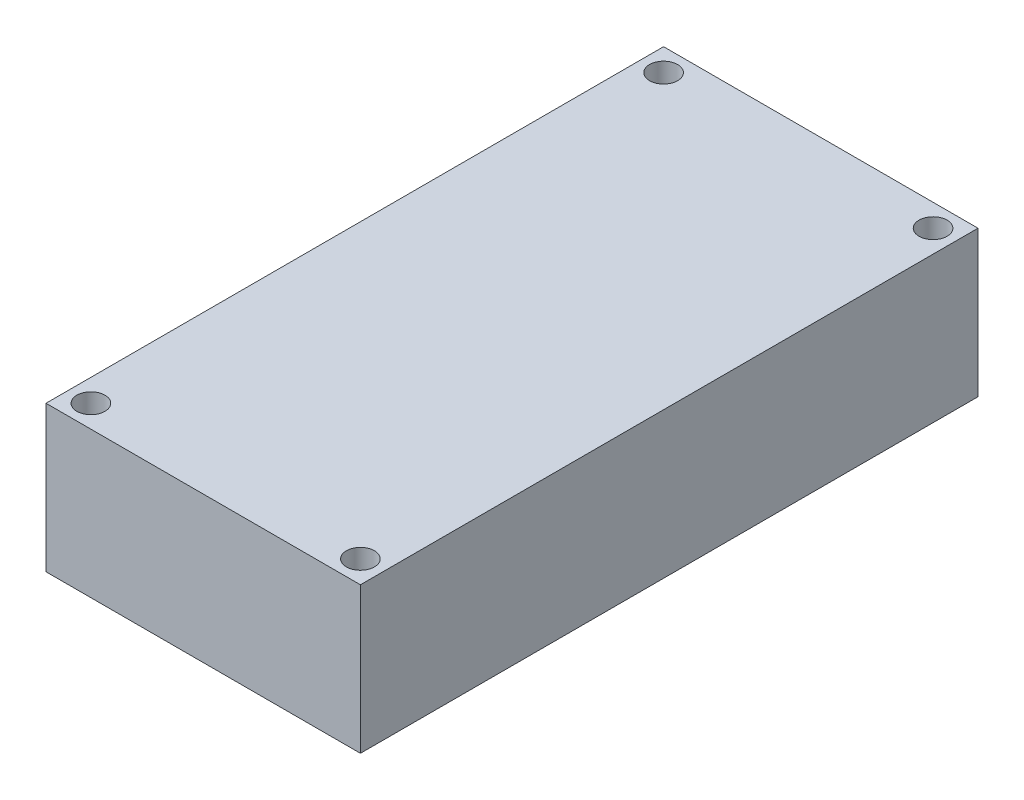
ISO-10303-21;
HEADER;
FILE_DESCRIPTION(('STEP AP214'),'2;1');
FILE_NAME('part.step','',(''),(''),'','','');
FILE_SCHEMA(('AUTOMOTIVE_DESIGN { 1 0 10303 214 1 1 1 1 }'));
ENDSEC;
DATA;
#1=APPLICATION_CONTEXT('core data for automotive mechanical design processes');
#2=APPLICATION_PROTOCOL_DEFINITION('international standard','automotive_design',2000,#1);
#3=PRODUCT_CONTEXT('',#1,'mechanical');
#4=PRODUCT('Part','Part','',(#3));
#5=PRODUCT_RELATED_PRODUCT_CATEGORY('part','',(#4));
#6=PRODUCT_DEFINITION_FORMATION('','',#4);
#7=PRODUCT_DEFINITION_CONTEXT('part definition',#1,'design');
#8=PRODUCT_DEFINITION('design','',#6,#7);
#9=PRODUCT_DEFINITION_SHAPE('','',#8);
#10=(LENGTH_UNIT() NAMED_UNIT(*) SI_UNIT(.MILLI.,.METRE.));
#11=(NAMED_UNIT(*) PLANE_ANGLE_UNIT() SI_UNIT($,.RADIAN.));
#12=(NAMED_UNIT(*) SI_UNIT($,.STERADIAN.) SOLID_ANGLE_UNIT());
#13=UNCERTAINTY_MEASURE_WITH_UNIT(LENGTH_MEASURE(1.E-05),#10,'distance_accuracy_value','');
#14=(GEOMETRIC_REPRESENTATION_CONTEXT(3) GLOBAL_UNCERTAINTY_ASSIGNED_CONTEXT((#13)) GLOBAL_UNIT_ASSIGNED_CONTEXT((#10,
#11,#12)) REPRESENTATION_CONTEXT('',''));
#15=CARTESIAN_POINT('',(0.,0.,0.));
#16=DIRECTION('',(0.,0.,1.));
#17=DIRECTION('',(1.,0.,0.));
#18=AXIS2_PLACEMENT_3D('',#15,#16,#17);
#19=CARTESIAN_POINT('',(-14.,6.49999999999999,27.5));
#20=DIRECTION('',(1.,0.,0.));
#21=DIRECTION('',(0.,1.,0.));
#22=AXIS2_PLACEMENT_3D('',#19,#20,#21);
#23=PLANE('',#22);
#24=DIRECTION('',(0.,-1.,0.));
#25=VECTOR('',#24,1.);
#26=CARTESIAN_POINT('',(-14.,6.49999999999999,-27.5));
#27=LINE('',#26,#25);
#28=CARTESIAN_POINT('',(-14.,6.49999999999999,-27.5));
#29=VERTEX_POINT('',#28);
#30=CARTESIAN_POINT('',(-14.,-6.5,-27.5));
#31=VERTEX_POINT('',#30);
#32=EDGE_CURVE('E97',#29,#31,#27,.T.);
#33=ORIENTED_EDGE('',*,*,#32,.T.);
#34=DIRECTION('',(0.,0.,-1.));
#35=VECTOR('',#34,1.);
#36=CARTESIAN_POINT('',(-14.,-6.5,27.5));
#37=LINE('',#36,#35);
#38=CARTESIAN_POINT('',(-14.,-6.5,27.5));
#39=VERTEX_POINT('',#38);
#40=EDGE_CURVE('E11',#39,#31,#37,.T.);
#41=ORIENTED_EDGE('',*,*,#40,.F.);
#42=DIRECTION('',(0.,-1.,0.));
#43=VECTOR('',#42,1.);
#44=CARTESIAN_POINT('',(-14.,6.49999999999999,27.5));
#45=LINE('',#44,#43);
#46=CARTESIAN_POINT('',(-14.,6.49999999999999,27.5));
#47=VERTEX_POINT('',#46);
#48=EDGE_CURVE('E85',#47,#39,#45,.T.);
#49=ORIENTED_EDGE('',*,*,#48,.F.);
#50=DIRECTION('',(0.,0.,-1.));
#51=VECTOR('',#50,1.);
#52=CARTESIAN_POINT('',(-14.,6.49999999999999,27.5));
#53=LINE('',#52,#51);
#54=EDGE_CURVE('E93',#47,#29,#53,.T.);
#55=ORIENTED_EDGE('',*,*,#54,.T.);
#56=EDGE_LOOP('',(#33,#41,#49,#55));
#57=FACE_BOUND('',#56,.T.);
#58=ADVANCED_FACE('F34',(#57),#23,.F.);
#59=CARTESIAN_POINT('',(14.,-6.49999999999999,27.5));
#60=DIRECTION('',(0.,1.,0.));
#61=DIRECTION('',(-1.,0.,0.));
#62=AXIS2_PLACEMENT_3D('',#59,#60,#61);
#63=PLANE('',#62);
#64=CARTESIAN_POINT('',(-12.,-6.5,25.5));
#65=DIRECTION('',(0.,1.,0.));
#66=DIRECTION('',(1.,0.,0.));
#67=AXIS2_PLACEMENT_3D('',#64,#65,#66);
#68=CIRCLE('',#67,1.25);
#69=CARTESIAN_POINT('',(-10.75,-6.5,25.5));
#70=VERTEX_POINT('',#69);
#71=EDGE_CURVE('E120',#70,#70,#68,.T.);
#72=ORIENTED_EDGE('',*,*,#71,.T.);
#73=EDGE_LOOP('',(#72));
#74=FACE_BOUND('',#73,.T.);
#75=CARTESIAN_POINT('',(12.,-6.5,25.5));
#76=DIRECTION('',(0.,1.,0.));
#77=DIRECTION('',(-1.,0.,0.));
#78=AXIS2_PLACEMENT_3D('',#75,#76,#77);
#79=CIRCLE('',#78,1.25);
#80=CARTESIAN_POINT('',(10.75,-6.5,25.5));
#81=VERTEX_POINT('',#80);
#82=EDGE_CURVE('E126',#81,#81,#79,.T.);
#83=ORIENTED_EDGE('',*,*,#82,.T.);
#84=EDGE_LOOP('',(#83));
#85=FACE_BOUND('',#84,.T.);
#86=CARTESIAN_POINT('',(12.,-6.5,-25.5));
#87=DIRECTION('',(0.,1.,0.));
#88=DIRECTION('',(1.,0.,0.));
#89=AXIS2_PLACEMENT_3D('',#86,#87,#88);
#90=CIRCLE('',#89,1.25);
#91=CARTESIAN_POINT('',(13.25,-6.5,-25.5));
#92=VERTEX_POINT('',#91);
#93=EDGE_CURVE('E114',#92,#92,#90,.T.);
#94=ORIENTED_EDGE('',*,*,#93,.T.);
#95=EDGE_LOOP('',(#94));
#96=FACE_BOUND('',#95,.T.);
#97=CARTESIAN_POINT('',(-12.,-6.5,-25.5));
#98=DIRECTION('',(0.,1.,0.));
#99=DIRECTION('',(-1.,0.,0.));
#100=AXIS2_PLACEMENT_3D('',#97,#98,#99);
#101=CIRCLE('',#100,1.25);
#102=CARTESIAN_POINT('',(-13.25,-6.5,-25.5));
#103=VERTEX_POINT('',#102);
#104=EDGE_CURVE('E100',#103,#103,#101,.T.);
#105=ORIENTED_EDGE('',*,*,#104,.T.);
#106=EDGE_LOOP('',(#105));
#107=FACE_BOUND('',#106,.T.);
#108=DIRECTION('',(1.,0.,0.));
#109=VECTOR('',#108,1.);
#110=CARTESIAN_POINT('',(14.,-6.49999999999999,-27.5));
#111=LINE('',#110,#109);
#112=CARTESIAN_POINT('',(14.,-6.49999999999999,-27.5));
#113=VERTEX_POINT('',#112);
#114=EDGE_CURVE('E89',#31,#113,#111,.T.);
#115=ORIENTED_EDGE('',*,*,#114,.T.);
#116=DIRECTION('',(0.,0.,-1.));
#117=VECTOR('',#116,1.);
#118=CARTESIAN_POINT('',(14.,-6.49999999999999,27.5));
#119=LINE('',#118,#117);
#120=CARTESIAN_POINT('',(14.,-6.49999999999999,27.5));
#121=VERTEX_POINT('',#120);
#122=EDGE_CURVE('E42',#121,#113,#119,.T.);
#123=ORIENTED_EDGE('',*,*,#122,.F.);
#124=DIRECTION('',(1.,0.,0.));
#125=VECTOR('',#124,1.);
#126=CARTESIAN_POINT('',(14.,-6.49999999999999,27.5));
#127=LINE('',#126,#125);
#128=EDGE_CURVE('E80',#39,#121,#127,.T.);
#129=ORIENTED_EDGE('',*,*,#128,.F.);
#130=ORIENTED_EDGE('',*,*,#40,.T.);
#131=EDGE_LOOP('',(#115,#123,#129,#130));
#132=FACE_BOUND('',#131,.T.);
#133=ADVANCED_FACE('F88',(#74,#85,#96,#107,#132),#63,.F.);
#134=CARTESIAN_POINT('',(14.,6.49999999999999,27.5));
#135=DIRECTION('',(-1.,0.,0.));
#136=DIRECTION('',(0.,0.,1.));
#137=AXIS2_PLACEMENT_3D('',#134,#135,#136);
#138=PLANE('',#137);
#139=DIRECTION('',(0.,1.,0.));
#140=VECTOR('',#139,1.);
#141=CARTESIAN_POINT('',(14.,6.49999999999999,-27.5));
#142=LINE('',#141,#140);
#143=CARTESIAN_POINT('',(14.,6.49999999999999,-27.5));
#144=VERTEX_POINT('',#143);
#145=EDGE_CURVE('E67',#113,#144,#142,.T.);
#146=ORIENTED_EDGE('',*,*,#145,.T.);
#147=DIRECTION('',(0.,0.,-1.));
#148=VECTOR('',#147,1.);
#149=CARTESIAN_POINT('',(14.,6.49999999999999,27.5));
#150=LINE('',#149,#148);
#151=CARTESIAN_POINT('',(14.,6.49999999999999,27.5));
#152=VERTEX_POINT('',#151);
#153=EDGE_CURVE('E90',#152,#144,#150,.T.);
#154=ORIENTED_EDGE('',*,*,#153,.F.);
#155=DIRECTION('',(0.,1.,0.));
#156=VECTOR('',#155,1.);
#157=CARTESIAN_POINT('',(14.,6.49999999999999,27.5));
#158=LINE('',#157,#156);
#159=EDGE_CURVE('E83',#121,#152,#158,.T.);
#160=ORIENTED_EDGE('',*,*,#159,.F.);
#161=ORIENTED_EDGE('',*,*,#122,.T.);
#162=EDGE_LOOP('',(#146,#154,#160,#161));
#163=FACE_BOUND('',#162,.T.);
#164=ADVANCED_FACE('F91',(#163),#138,.F.);
#165=CARTESIAN_POINT('',(14.,6.49999999999999,27.5));
#166=DIRECTION('',(0.,-1.,0.));
#167=DIRECTION('',(1.,0.,0.));
#168=AXIS2_PLACEMENT_3D('',#165,#166,#167);
#169=PLANE('',#168);
#170=CARTESIAN_POINT('',(-12.,6.49999999999999,25.5));
#171=DIRECTION('',(0.,1.,0.));
#172=DIRECTION('',(1.,0.,0.));
#173=AXIS2_PLACEMENT_3D('',#170,#171,#172);
#174=CIRCLE('',#173,1.25);
#175=CARTESIAN_POINT('',(-10.75,6.49999999999999,25.5));
#176=VERTEX_POINT('',#175);
#177=EDGE_CURVE('E117',#176,#176,#174,.T.);
#178=ORIENTED_EDGE('',*,*,#177,.F.);
#179=EDGE_LOOP('',(#178));
#180=FACE_BOUND('',#179,.T.);
#181=CARTESIAN_POINT('',(12.,6.49999999999999,25.5));
#182=DIRECTION('',(0.,1.,0.));
#183=DIRECTION('',(-1.,0.,0.));
#184=AXIS2_PLACEMENT_3D('',#181,#182,#183);
#185=CIRCLE('',#184,1.25);
#186=CARTESIAN_POINT('',(10.75,6.49999999999999,25.5));
#187=VERTEX_POINT('',#186);
#188=EDGE_CURVE('E123',#187,#187,#185,.T.);
#189=ORIENTED_EDGE('',*,*,#188,.F.);
#190=EDGE_LOOP('',(#189));
#191=FACE_BOUND('',#190,.T.);
#192=CARTESIAN_POINT('',(12.,6.49999999999999,-25.5));
#193=DIRECTION('',(0.,1.,0.));
#194=DIRECTION('',(1.,0.,0.));
#195=AXIS2_PLACEMENT_3D('',#192,#193,#194);
#196=CIRCLE('',#195,1.25);
#197=CARTESIAN_POINT('',(13.25,6.49999999999999,-25.5));
#198=VERTEX_POINT('',#197);
#199=EDGE_CURVE('E129',#198,#198,#196,.T.);
#200=ORIENTED_EDGE('',*,*,#199,.F.);
#201=EDGE_LOOP('',(#200));
#202=FACE_BOUND('',#201,.T.);
#203=CARTESIAN_POINT('',(-12.,6.49999999999999,-25.5));
#204=DIRECTION('',(0.,1.,0.));
#205=DIRECTION('',(-1.,0.,0.));
#206=AXIS2_PLACEMENT_3D('',#203,#204,#205);
#207=CIRCLE('',#206,1.25);
#208=CARTESIAN_POINT('',(-13.25,6.49999999999999,-25.5));
#209=VERTEX_POINT('',#208);
#210=EDGE_CURVE('E111',#209,#209,#207,.T.);
#211=ORIENTED_EDGE('',*,*,#210,.F.);
#212=EDGE_LOOP('',(#211));
#213=FACE_BOUND('',#212,.T.);
#214=DIRECTION('',(-1.,0.,0.));
#215=VECTOR('',#214,1.);
#216=CARTESIAN_POINT('',(14.,6.49999999999999,-27.5));
#217=LINE('',#216,#215);
#218=EDGE_CURVE('E73',#144,#29,#217,.T.);
#219=ORIENTED_EDGE('',*,*,#218,.T.);
#220=ORIENTED_EDGE('',*,*,#54,.F.);
#221=DIRECTION('',(-1.,0.,0.));
#222=VECTOR('',#221,1.);
#223=CARTESIAN_POINT('',(14.,6.49999999999999,27.5));
#224=LINE('',#223,#222);
#225=EDGE_CURVE('E50',#152,#47,#224,.T.);
#226=ORIENTED_EDGE('',*,*,#225,.F.);
#227=ORIENTED_EDGE('',*,*,#153,.T.);
#228=EDGE_LOOP('',(#219,#220,#226,#227));
#229=FACE_BOUND('',#228,.T.);
#230=ADVANCED_FACE('F105',(#180,#191,#202,#213,#229),#169,.F.);
#231=CARTESIAN_POINT('',(0.,0.,27.5));
#232=DIRECTION('',(0.,0.,-1.));
#233=DIRECTION('',(-1.,0.,0.));
#234=AXIS2_PLACEMENT_3D('',#231,#232,#233);
#235=PLANE('',#234);
#236=ORIENTED_EDGE('',*,*,#48,.T.);
#237=ORIENTED_EDGE('',*,*,#128,.T.);
#238=ORIENTED_EDGE('',*,*,#159,.T.);
#239=ORIENTED_EDGE('',*,*,#225,.T.);
#240=EDGE_LOOP('',(#236,#237,#238,#239));
#241=FACE_BOUND('',#240,.T.);
#242=ADVANCED_FACE('F81',(#241),#235,.F.);
#243=CARTESIAN_POINT('',(0.,0.,-27.5));
#244=DIRECTION('',(0.,0.,-1.));
#245=DIRECTION('',(-1.,0.,0.));
#246=AXIS2_PLACEMENT_3D('',#243,#244,#245);
#247=PLANE('',#246);
#248=ORIENTED_EDGE('',*,*,#32,.F.);
#249=ORIENTED_EDGE('',*,*,#218,.F.);
#250=ORIENTED_EDGE('',*,*,#145,.F.);
#251=ORIENTED_EDGE('',*,*,#114,.F.);
#252=EDGE_LOOP('',(#248,#249,#250,#251));
#253=FACE_BOUND('',#252,.T.);
#254=ADVANCED_FACE('F108',(#253),#247,.T.);
#255=CARTESIAN_POINT('',(-12.,-6.5,-25.5));
#256=DIRECTION('',(0.,1.,0.));
#257=DIRECTION('',(-1.,0.,0.));
#258=AXIS2_PLACEMENT_3D('',#255,#256,#257);
#259=CYLINDRICAL_SURFACE('',#258,1.25);
#260=ORIENTED_EDGE('',*,*,#104,.F.);
#261=EDGE_LOOP('',(#260));
#262=FACE_BOUND('',#261,.T.);
#263=ORIENTED_EDGE('',*,*,#210,.T.);
#264=EDGE_LOOP('',(#263));
#265=FACE_BOUND('',#264,.T.);
#266=ADVANCED_FACE('F141',(#262,#265),#259,.F.);
#267=CARTESIAN_POINT('',(12.,-6.5,-25.5));
#268=DIRECTION('',(0.,1.,0.));
#269=DIRECTION('',(-1.,0.,0.));
#270=AXIS2_PLACEMENT_3D('',#267,#268,#269);
#271=CYLINDRICAL_SURFACE('',#270,1.25);
#272=ORIENTED_EDGE('',*,*,#93,.F.);
#273=EDGE_LOOP('',(#272));
#274=FACE_BOUND('',#273,.T.);
#275=ORIENTED_EDGE('',*,*,#199,.T.);
#276=EDGE_LOOP('',(#275));
#277=FACE_BOUND('',#276,.T.);
#278=ADVANCED_FACE('F137',(#274,#277),#271,.F.);
#279=CARTESIAN_POINT('',(12.,-6.5,25.5));
#280=DIRECTION('',(0.,1.,0.));
#281=DIRECTION('',(-1.,0.,0.));
#282=AXIS2_PLACEMENT_3D('',#279,#280,#281);
#283=CYLINDRICAL_SURFACE('',#282,1.25);
#284=ORIENTED_EDGE('',*,*,#82,.F.);
#285=EDGE_LOOP('',(#284));
#286=FACE_BOUND('',#285,.T.);
#287=ORIENTED_EDGE('',*,*,#188,.T.);
#288=EDGE_LOOP('',(#287));
#289=FACE_BOUND('',#288,.T.);
#290=ADVANCED_FACE('F140',(#286,#289),#283,.F.);
#291=CARTESIAN_POINT('',(-12.,-6.5,25.5));
#292=DIRECTION('',(0.,1.,0.));
#293=DIRECTION('',(-1.,0.,0.));
#294=AXIS2_PLACEMENT_3D('',#291,#292,#293);
#295=CYLINDRICAL_SURFACE('',#294,1.25);
#296=ORIENTED_EDGE('',*,*,#71,.F.);
#297=EDGE_LOOP('',(#296));
#298=FACE_BOUND('',#297,.T.);
#299=ORIENTED_EDGE('',*,*,#177,.T.);
#300=EDGE_LOOP('',(#299));
#301=FACE_BOUND('',#300,.T.);
#302=ADVANCED_FACE('F210',(#298,#301),#295,.F.);
#303=CLOSED_SHELL('',(#58,#133,#164,#230,#242,#254,#266,#278,#290,#302));
#304=MANIFOLD_SOLID_BREP('B2',#303);
#305=ADVANCED_BREP_SHAPE_REPRESENTATION('',(#18,#304),#14);
#306=SHAPE_DEFINITION_REPRESENTATION(#9,#305);
ENDSEC;
END-ISO-10303-21;
